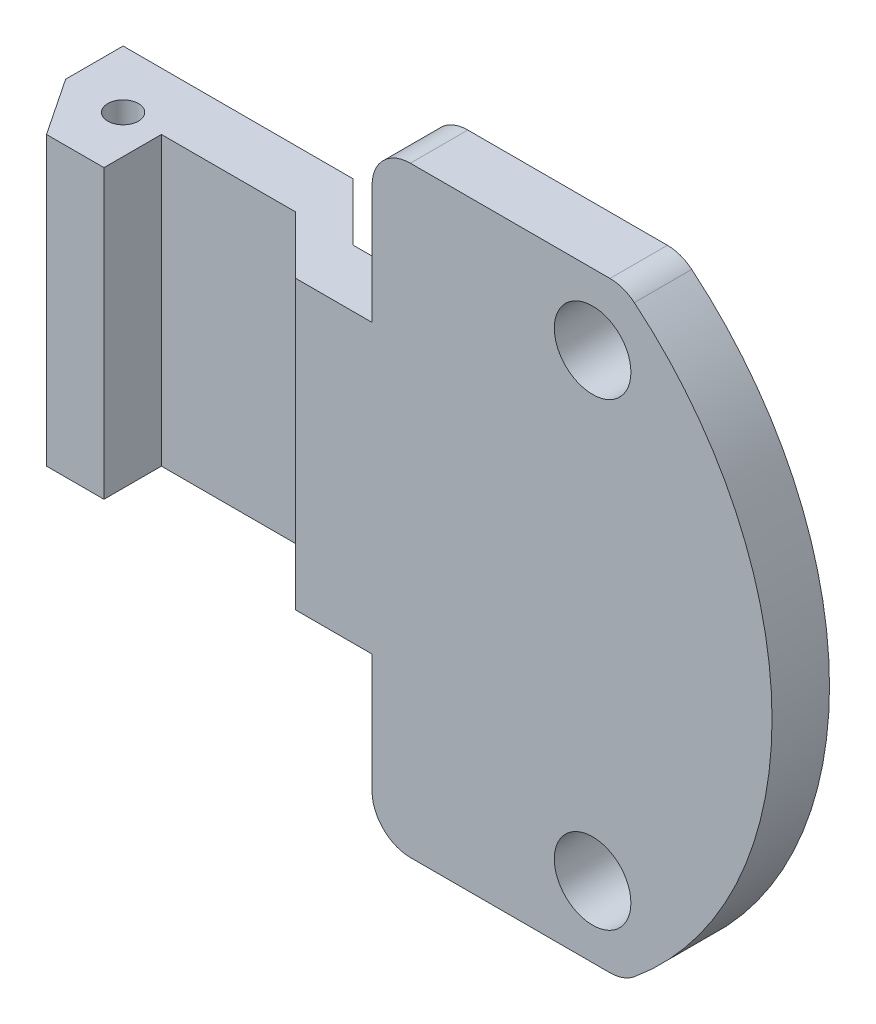
ISO-10303-21;
HEADER;
FILE_DESCRIPTION(('STEP AP214'),'2;1');
FILE_NAME('part.step','',(''),(''),'','','');
FILE_SCHEMA(('AUTOMOTIVE_DESIGN { 1 0 10303 214 1 1 1 1 }'));
ENDSEC;
DATA;
#1=APPLICATION_CONTEXT('core data for automotive mechanical design processes');
#2=APPLICATION_PROTOCOL_DEFINITION('international standard','automotive_design',2000,#1);
#3=PRODUCT_CONTEXT('',#1,'mechanical');
#4=PRODUCT('Part','Part','',(#3));
#5=PRODUCT_RELATED_PRODUCT_CATEGORY('part','',(#4));
#6=PRODUCT_DEFINITION_FORMATION('','',#4);
#7=PRODUCT_DEFINITION_CONTEXT('part definition',#1,'design');
#8=PRODUCT_DEFINITION('design','',#6,#7);
#9=PRODUCT_DEFINITION_SHAPE('','',#8);
#10=(LENGTH_UNIT() NAMED_UNIT(*) SI_UNIT(.MILLI.,.METRE.));
#11=(NAMED_UNIT(*) PLANE_ANGLE_UNIT() SI_UNIT($,.RADIAN.));
#12=(NAMED_UNIT(*) SI_UNIT($,.STERADIAN.) SOLID_ANGLE_UNIT());
#13=UNCERTAINTY_MEASURE_WITH_UNIT(LENGTH_MEASURE(1.E-05),#10,'distance_accuracy_value','');
#14=(GEOMETRIC_REPRESENTATION_CONTEXT(3) GLOBAL_UNCERTAINTY_ASSIGNED_CONTEXT((#13)) GLOBAL_UNIT_ASSIGNED_CONTEXT((#10,
#11,#12)) REPRESENTATION_CONTEXT('',''));
#15=CARTESIAN_POINT('',(0.,0.,0.));
#16=DIRECTION('',(0.,0.,1.));
#17=DIRECTION('',(1.,0.,0.));
#18=AXIS2_PLACEMENT_3D('',#15,#16,#17);
#19=CARTESIAN_POINT('',(0.,19.05,0.));
#20=DIRECTION('',(0.,1.,0.));
#21=DIRECTION('',(0.,0.,1.));
#22=AXIS2_PLACEMENT_3D('',#19,#20,#21);
#23=PLANE('',#22);
#24=CARTESIAN_POINT('',(-34.29,19.05,-3.81));
#25=DIRECTION('',(0.,1.,0.));
#26=DIRECTION('',(0.,0.,1.));
#27=AXIS2_PLACEMENT_3D('',#24,#25,#26);
#28=CIRCLE('',#27,1.016);
#29=CARTESIAN_POINT('',(-34.29,19.05,-4.826));
#30=VERTEX_POINT('',#29);
#31=EDGE_CURVE('E218',#30,#30,#28,.T.);
#32=ORIENTED_EDGE('',*,*,#31,.F.);
#33=EDGE_LOOP('',(#32));
#34=FACE_BOUND('',#33,.T.);
#35=DIRECTION('',(1.,0.,0.));
#36=VECTOR('',#35,1.);
#37=CARTESIAN_POINT('',(0.,19.05,0.));
#38=LINE('',#37,#36);
#39=CARTESIAN_POINT('',(-19.05,19.05,0.));
#40=VERTEX_POINT('',#39);
#41=CARTESIAN_POINT('',(-13.97,19.05,0.));
#42=VERTEX_POINT('',#41);
#43=EDGE_CURVE('E195',#40,#42,#38,.T.);
#44=ORIENTED_EDGE('',*,*,#43,.T.);
#45=DIRECTION('',(0.,0.,1.));
#46=VECTOR('',#45,1.);
#47=CARTESIAN_POINT('',(-13.97,19.05,-51.7043219116373));
#48=LINE('',#47,#46);
#49=CARTESIAN_POINT('',(-13.97,19.05,-3.80999999999998));
#50=VERTEX_POINT('',#49);
#51=EDGE_CURVE('E177',#50,#42,#48,.T.);
#52=ORIENTED_EDGE('',*,*,#51,.F.);
#53=DIRECTION('',(-1.,0.,0.));
#54=VECTOR('',#53,1.);
#55=CARTESIAN_POINT('',(-19.0500000000001,19.05,-3.80999999999998));
#56=LINE('',#55,#54);
#57=CARTESIAN_POINT('',(-19.0500000000001,19.05,-3.80999999999998));
#58=VERTEX_POINT('',#57);
#59=EDGE_CURVE('E204',#50,#58,#56,.T.);
#60=ORIENTED_EDGE('',*,*,#59,.T.);
#61=DIRECTION('',(-0.707106781186544,0.,-0.707106781186551));
#62=VECTOR('',#61,1.);
#63=CARTESIAN_POINT('',(-19.0500000000001,19.05,-3.80999999999998));
#64=LINE('',#63,#62);
#65=CARTESIAN_POINT('',(-22.86,19.05,-7.61999999999997));
#66=VERTEX_POINT('',#65);
#67=EDGE_CURVE('E206',#58,#66,#64,.T.);
#68=ORIENTED_EDGE('',*,*,#67,.T.);
#69=DIRECTION('',(-1.,0.,0.));
#70=VECTOR('',#69,1.);
#71=CARTESIAN_POINT('',(-31.75,19.05,-7.61999999999996));
#72=LINE('',#71,#70);
#73=CARTESIAN_POINT('',(-38.1,19.05,-7.61999999999996));
#74=VERTEX_POINT('',#73);
#75=EDGE_CURVE('E237',#66,#74,#72,.T.);
#76=ORIENTED_EDGE('',*,*,#75,.T.);
#77=DIRECTION('',(0.,0.,1.));
#78=VECTOR('',#77,1.);
#79=CARTESIAN_POINT('',(-38.1,19.05,-7.61999999999996));
#80=LINE('',#79,#78);
#81=CARTESIAN_POINT('',(-38.1,19.05,-3.81));
#82=VERTEX_POINT('',#81);
#83=EDGE_CURVE('E325',#74,#82,#80,.T.);
#84=ORIENTED_EDGE('',*,*,#83,.T.);
#85=DIRECTION('',(0.554700196225223,0.,0.832050294337848));
#86=VECTOR('',#85,1.);
#87=CARTESIAN_POINT('',(-38.1,19.05,-3.81));
#88=LINE('',#87,#86);
#89=CARTESIAN_POINT('',(-35.56,19.05,0.));
#90=VERTEX_POINT('',#89);
#91=EDGE_CURVE('E327',#82,#90,#88,.T.);
#92=ORIENTED_EDGE('',*,*,#91,.T.);
#93=DIRECTION('',(1.,0.,0.));
#94=VECTOR('',#93,1.);
#95=CARTESIAN_POINT('',(-35.56,19.05,0.));
#96=LINE('',#95,#94);
#97=CARTESIAN_POINT('',(-31.75,19.05,0.));
#98=VERTEX_POINT('',#97);
#99=EDGE_CURVE('E329',#90,#98,#96,.T.);
#100=ORIENTED_EDGE('',*,*,#99,.T.);
#101=DIRECTION('',(0.,0.,-1.));
#102=VECTOR('',#101,1.);
#103=CARTESIAN_POINT('',(-31.75,19.05,-3.81));
#104=LINE('',#103,#102);
#105=CARTESIAN_POINT('',(-31.75,19.05,-3.81));
#106=VERTEX_POINT('',#105);
#107=EDGE_CURVE('E331',#98,#106,#104,.T.);
#108=ORIENTED_EDGE('',*,*,#107,.T.);
#109=DIRECTION('',(1.,0.,0.));
#110=VECTOR('',#109,1.);
#111=CARTESIAN_POINT('',(-31.75,19.05,-3.81));
#112=LINE('',#111,#110);
#113=CARTESIAN_POINT('',(-22.86,19.05,-3.81));
#114=VERTEX_POINT('',#113);
#115=EDGE_CURVE('E208',#106,#114,#112,.T.);
#116=ORIENTED_EDGE('',*,*,#115,.T.);
#117=DIRECTION('',(0.707106781186548,0.,0.707106781186547));
#118=VECTOR('',#117,1.);
#119=CARTESIAN_POINT('',(-22.86,19.05,-3.81));
#120=LINE('',#119,#118);
#121=EDGE_CURVE('E202',#114,#40,#120,.T.);
#122=ORIENTED_EDGE('',*,*,#121,.T.);
#123=EDGE_LOOP('',(#44,#52,#60,#68,#76,#84,#92,#100,#108,#116,#122));
#124=FACE_BOUND('',#123,.T.);
#125=ADVANCED_FACE('F45',(#34,#124),#23,.T.);
#126=CARTESIAN_POINT('',(0.,0.,0.));
#127=DIRECTION('',(0.,1.,0.));
#128=DIRECTION('',(0.,0.,1.));
#129=AXIS2_PLACEMENT_3D('',#126,#127,#128);
#130=PLANE('',#129);
#131=DIRECTION('',(-1.,0.,0.));
#132=VECTOR('',#131,1.);
#133=CARTESIAN_POINT('',(-19.0500000000001,0.,-3.80999999999998));
#134=LINE('',#133,#132);
#135=CARTESIAN_POINT('',(-13.97,0.,-3.80999999999998));
#136=VERTEX_POINT('',#135);
#137=CARTESIAN_POINT('',(-19.0500000000001,0.,-3.80999999999998));
#138=VERTEX_POINT('',#137);
#139=EDGE_CURVE('E231',#136,#138,#134,.T.);
#140=ORIENTED_EDGE('',*,*,#139,.F.);
#141=DIRECTION('',(0.,0.,1.));
#142=VECTOR('',#141,1.);
#143=CARTESIAN_POINT('',(-13.97,0.,-51.7043219116373));
#144=LINE('',#143,#142);
#145=CARTESIAN_POINT('',(-13.97,0.,0.));
#146=VERTEX_POINT('',#145);
#147=EDGE_CURVE('E186',#136,#146,#144,.T.);
#148=ORIENTED_EDGE('',*,*,#147,.T.);
#149=DIRECTION('',(1.,0.,0.));
#150=VECTOR('',#149,1.);
#151=CARTESIAN_POINT('',(0.,0.,0.));
#152=LINE('',#151,#150);
#153=CARTESIAN_POINT('',(-19.05,0.,0.));
#154=VERTEX_POINT('',#153);
#155=EDGE_CURVE('E228',#154,#146,#152,.T.);
#156=ORIENTED_EDGE('',*,*,#155,.F.);
#157=DIRECTION('',(0.707106781186548,0.,0.707106781186547));
#158=VECTOR('',#157,1.);
#159=CARTESIAN_POINT('',(-22.86,0.,-3.81));
#160=LINE('',#159,#158);
#161=CARTESIAN_POINT('',(-22.86,0.,-3.81));
#162=VERTEX_POINT('',#161);
#163=EDGE_CURVE('E226',#162,#154,#160,.T.);
#164=ORIENTED_EDGE('',*,*,#163,.F.);
#165=DIRECTION('',(1.,0.,0.));
#166=VECTOR('',#165,1.);
#167=CARTESIAN_POINT('',(-31.75,0.,-3.81));
#168=LINE('',#167,#166);
#169=CARTESIAN_POINT('',(-31.75,0.,-3.81));
#170=VERTEX_POINT('',#169);
#171=EDGE_CURVE('E224',#170,#162,#168,.T.);
#172=ORIENTED_EDGE('',*,*,#171,.F.);
#173=DIRECTION('',(0.,0.,-1.));
#174=VECTOR('',#173,1.);
#175=CARTESIAN_POINT('',(-31.75,0.,-3.81));
#176=LINE('',#175,#174);
#177=CARTESIAN_POINT('',(-31.75,0.,0.));
#178=VERTEX_POINT('',#177);
#179=EDGE_CURVE('E222',#178,#170,#176,.T.);
#180=ORIENTED_EDGE('',*,*,#179,.F.);
#181=DIRECTION('',(1.,0.,0.));
#182=VECTOR('',#181,1.);
#183=CARTESIAN_POINT('',(-35.56,0.,0.));
#184=LINE('',#183,#182);
#185=CARTESIAN_POINT('',(-35.56,0.,0.));
#186=VERTEX_POINT('',#185);
#187=EDGE_CURVE('E220',#186,#178,#184,.T.);
#188=ORIENTED_EDGE('',*,*,#187,.F.);
#189=DIRECTION('',(0.554700196225223,0.,0.832050294337848));
#190=VECTOR('',#189,1.);
#191=CARTESIAN_POINT('',(-38.1,0.,-3.81));
#192=LINE('',#191,#190);
#193=CARTESIAN_POINT('',(-38.1,0.,-3.81));
#194=VERTEX_POINT('',#193);
#195=EDGE_CURVE('E217',#194,#186,#192,.T.);
#196=ORIENTED_EDGE('',*,*,#195,.F.);
#197=DIRECTION('',(0.,0.,1.));
#198=VECTOR('',#197,1.);
#199=CARTESIAN_POINT('',(-38.1,0.,-7.61999999999996));
#200=LINE('',#199,#198);
#201=CARTESIAN_POINT('',(-38.1,0.,-7.61999999999996));
#202=VERTEX_POINT('',#201);
#203=EDGE_CURVE('E215',#202,#194,#200,.T.);
#204=ORIENTED_EDGE('',*,*,#203,.F.);
#205=DIRECTION('',(-1.,0.,0.));
#206=VECTOR('',#205,1.);
#207=CARTESIAN_POINT('',(-22.86,0.,-7.61999999999997));
#208=LINE('',#207,#206);
#209=CARTESIAN_POINT('',(-22.86,0.,-7.61999999999997));
#210=VERTEX_POINT('',#209);
#211=EDGE_CURVE('E235',#210,#202,#208,.T.);
#212=ORIENTED_EDGE('',*,*,#211,.F.);
#213=DIRECTION('',(-0.707106781186544,0.,-0.707106781186551));
#214=VECTOR('',#213,1.);
#215=CARTESIAN_POINT('',(-19.0500000000001,0.,-3.80999999999998));
#216=LINE('',#215,#214);
#217=EDGE_CURVE('E233',#138,#210,#216,.T.);
#218=ORIENTED_EDGE('',*,*,#217,.F.);
#219=EDGE_LOOP('',(#140,#148,#156,#164,#172,#180,#188,#196,#204,#212,#218));
#220=FACE_BOUND('',#219,.T.);
#221=CARTESIAN_POINT('',(-34.29,0.,-3.81));
#222=DIRECTION('',(0.,1.,0.));
#223=DIRECTION('',(0.,0.,1.));
#224=AXIS2_PLACEMENT_3D('',#221,#222,#223);
#225=CIRCLE('',#224,1.016);
#226=CARTESIAN_POINT('',(-34.29,0.,-4.826));
#227=VERTEX_POINT('',#226);
#228=EDGE_CURVE('E320',#227,#227,#225,.T.);
#229=ORIENTED_EDGE('',*,*,#228,.T.);
#230=EDGE_LOOP('',(#229));
#231=FACE_BOUND('',#230,.T.);
#232=ADVANCED_FACE('F344',(#220,#231),#130,.F.);
#233=CARTESIAN_POINT('',(-38.1,19.05,-7.61999999999996));
#234=DIRECTION('',(1.,0.,0.));
#235=DIRECTION('',(0.,0.,-1.));
#236=AXIS2_PLACEMENT_3D('',#233,#234,#235);
#237=PLANE('',#236);
#238=ORIENTED_EDGE('',*,*,#203,.T.);
#239=DIRECTION('',(0.,-1.,0.));
#240=VECTOR('',#239,1.);
#241=CARTESIAN_POINT('',(-38.1,19.05,-3.81));
#242=LINE('',#241,#240);
#243=EDGE_CURVE('E257',#82,#194,#242,.T.);
#244=ORIENTED_EDGE('',*,*,#243,.F.);
#245=ORIENTED_EDGE('',*,*,#83,.F.);
#246=DIRECTION('',(0.,-1.,0.));
#247=VECTOR('',#246,1.);
#248=CARTESIAN_POINT('',(-38.1,19.05,-7.61999999999996));
#249=LINE('',#248,#247);
#250=EDGE_CURVE('E260',#74,#202,#249,.T.);
#251=ORIENTED_EDGE('',*,*,#250,.T.);
#252=EDGE_LOOP('',(#238,#244,#245,#251));
#253=FACE_BOUND('',#252,.T.);
#254=ADVANCED_FACE('F410',(#253),#237,.F.);
#255=CARTESIAN_POINT('',(-38.1,19.05,-3.81));
#256=DIRECTION('',(0.832050294337848,0.,-0.554700196225223));
#257=DIRECTION('',(-0.554700196225223,0.,-0.832050294337848));
#258=AXIS2_PLACEMENT_3D('',#255,#256,#257);
#259=PLANE('',#258);
#260=ORIENTED_EDGE('',*,*,#195,.T.);
#261=DIRECTION('',(0.,-1.,0.));
#262=VECTOR('',#261,1.);
#263=CARTESIAN_POINT('',(-35.56,19.05,0.));
#264=LINE('',#263,#262);
#265=EDGE_CURVE('E254',#90,#186,#264,.T.);
#266=ORIENTED_EDGE('',*,*,#265,.F.);
#267=ORIENTED_EDGE('',*,*,#91,.F.);
#268=ORIENTED_EDGE('',*,*,#243,.T.);
#269=EDGE_LOOP('',(#260,#266,#267,#268));
#270=FACE_BOUND('',#269,.T.);
#271=ADVANCED_FACE('F438',(#270),#259,.F.);
#272=CARTESIAN_POINT('',(-35.56,19.05,0.));
#273=DIRECTION('',(0.,0.,-1.));
#274=DIRECTION('',(-1.,0.,0.));
#275=AXIS2_PLACEMENT_3D('',#272,#273,#274);
#276=PLANE('',#275);
#277=ORIENTED_EDGE('',*,*,#187,.T.);
#278=DIRECTION('',(0.,-1.,0.));
#279=VECTOR('',#278,1.);
#280=CARTESIAN_POINT('',(-31.75,19.05,0.));
#281=LINE('',#280,#279);
#282=EDGE_CURVE('E251',#98,#178,#281,.T.);
#283=ORIENTED_EDGE('',*,*,#282,.F.);
#284=ORIENTED_EDGE('',*,*,#99,.F.);
#285=ORIENTED_EDGE('',*,*,#265,.T.);
#286=EDGE_LOOP('',(#277,#283,#284,#285));
#287=FACE_BOUND('',#286,.T.);
#288=ADVANCED_FACE('F434',(#287),#276,.F.);
#289=CARTESIAN_POINT('',(-31.75,19.05,-3.81));
#290=DIRECTION('',(-1.,0.,0.));
#291=DIRECTION('',(0.,0.,1.));
#292=AXIS2_PLACEMENT_3D('',#289,#290,#291);
#293=PLANE('',#292);
#294=ORIENTED_EDGE('',*,*,#179,.T.);
#295=DIRECTION('',(0.,-1.,0.));
#296=VECTOR('',#295,1.);
#297=CARTESIAN_POINT('',(-31.75,19.05,-3.81));
#298=LINE('',#297,#296);
#299=EDGE_CURVE('E248',#106,#170,#298,.T.);
#300=ORIENTED_EDGE('',*,*,#299,.F.);
#301=ORIENTED_EDGE('',*,*,#107,.F.);
#302=ORIENTED_EDGE('',*,*,#282,.T.);
#303=EDGE_LOOP('',(#294,#300,#301,#302));
#304=FACE_BOUND('',#303,.T.);
#305=ADVANCED_FACE('F431',(#304),#293,.F.);
#306=CARTESIAN_POINT('',(-31.75,19.05,-3.81));
#307=DIRECTION('',(0.,0.,-1.));
#308=DIRECTION('',(-1.,0.,0.));
#309=AXIS2_PLACEMENT_3D('',#306,#307,#308);
#310=PLANE('',#309);
#311=ORIENTED_EDGE('',*,*,#171,.T.);
#312=DIRECTION('',(0.,-1.,0.));
#313=VECTOR('',#312,1.);
#314=CARTESIAN_POINT('',(-22.86,19.05,-3.81));
#315=LINE('',#314,#313);
#316=EDGE_CURVE('E245',#114,#162,#315,.T.);
#317=ORIENTED_EDGE('',*,*,#316,.F.);
#318=ORIENTED_EDGE('',*,*,#115,.F.);
#319=ORIENTED_EDGE('',*,*,#299,.T.);
#320=EDGE_LOOP('',(#311,#317,#318,#319));
#321=FACE_BOUND('',#320,.T.);
#322=ADVANCED_FACE('F337',(#321),#310,.F.);
#323=CARTESIAN_POINT('',(-22.86,19.05,-3.81));
#324=DIRECTION('',(0.707106781186547,0.,-0.707106781186548));
#325=DIRECTION('',(-0.707106781186548,0.,-0.707106781186547));
#326=AXIS2_PLACEMENT_3D('',#323,#324,#325);
#327=PLANE('',#326);
#328=ORIENTED_EDGE('',*,*,#163,.T.);
#329=DIRECTION('',(0.,-1.,0.));
#330=VECTOR('',#329,1.);
#331=CARTESIAN_POINT('',(-19.05,19.05,0.));
#332=LINE('',#331,#330);
#333=EDGE_CURVE('E243',#40,#154,#332,.T.);
#334=ORIENTED_EDGE('',*,*,#333,.F.);
#335=ORIENTED_EDGE('',*,*,#121,.F.);
#336=ORIENTED_EDGE('',*,*,#316,.T.);
#337=EDGE_LOOP('',(#328,#334,#335,#336));
#338=FACE_BOUND('',#337,.T.);
#339=ADVANCED_FACE('F341',(#338),#327,.F.);
#340=CARTESIAN_POINT('',(0.,19.05,0.));
#341=DIRECTION('',(0.,0.,-1.));
#342=DIRECTION('',(-1.,0.,0.));
#343=AXIS2_PLACEMENT_3D('',#340,#341,#342);
#344=PLANE('',#343);
#345=DIRECTION('',(1.,0.,0.));
#346=VECTOR('',#345,1.);
#347=CARTESIAN_POINT('',(0.,-10.4139999999989,0.));
#348=LINE('',#347,#346);
#349=CARTESIAN_POINT('',(-11.43,-10.4139999999989,0.));
#350=VERTEX_POINT('',#349);
#351=CARTESIAN_POINT('',(1.80656142671847,-10.4139999999989,0.));
#352=VERTEX_POINT('',#351);
#353=EDGE_CURVE('E301',#350,#352,#348,.T.);
#354=ORIENTED_EDGE('',*,*,#353,.T.);
#355=CARTESIAN_POINT('',(1.80656142671847,-7.87399999999887,0.));
#356=DIRECTION('',(0.,0.,-1.));
#357=DIRECTION('',(-1.,0.,0.));
#358=AXIS2_PLACEMENT_3D('',#355,#356,#357);
#359=CIRCLE('',#358,2.54);
#360=CARTESIAN_POINT('',(3.4216088879706,-9.83441365479294,0.));
#361=VERTEX_POINT('',#360);
#362=EDGE_CURVE('E273',#352,#361,#359,.F.);
#363=ORIENTED_EDGE('',*,*,#362,.T.);
#364=CARTESIAN_POINT('',(-12.5272556784662,9.52500000000047,0.));
#365=DIRECTION('',(0.,0.,1.));
#366=DIRECTION('',(1.,0.,0.));
#367=AXIS2_PLACEMENT_3D('',#364,#365,#366);
#368=CIRCLE('',#367,25.0829260258038);
#369=CARTESIAN_POINT('',(3.42160888797036,28.8844136547941,0.));
#370=VERTEX_POINT('',#369);
#371=EDGE_CURVE('E365',#370,#361,#368,.F.);
#372=ORIENTED_EDGE('',*,*,#371,.F.);
#373=CARTESIAN_POINT('',(1.80656142671824,26.924,0.));
#374=DIRECTION('',(0.,0.,-1.));
#375=DIRECTION('',(-1.,0.,0.));
#376=AXIS2_PLACEMENT_3D('',#373,#374,#375);
#377=CIRCLE('',#376,2.54);
#378=CARTESIAN_POINT('',(1.80656142671824,29.464,0.));
#379=VERTEX_POINT('',#378);
#380=EDGE_CURVE('E271',#370,#379,#377,.F.);
#381=ORIENTED_EDGE('',*,*,#380,.T.);
#382=DIRECTION('',(1.,0.,0.));
#383=VECTOR('',#382,1.);
#384=CARTESIAN_POINT('',(0.,29.464,0.));
#385=LINE('',#384,#383);
#386=CARTESIAN_POINT('',(-11.43,29.464,0.));
#387=VERTEX_POINT('',#386);
#388=EDGE_CURVE('E199',#387,#379,#385,.T.);
#389=ORIENTED_EDGE('',*,*,#388,.F.);
#390=CARTESIAN_POINT('',(-11.43,26.924,0.));
#391=DIRECTION('',(0.,0.,-1.));
#392=DIRECTION('',(-1.,0.,0.));
#393=AXIS2_PLACEMENT_3D('',#390,#391,#392);
#394=CIRCLE('',#393,2.54);
#395=CARTESIAN_POINT('',(-13.97,26.924,0.));
#396=VERTEX_POINT('',#395);
#397=EDGE_CURVE('E197',#387,#396,#394,.F.);
#398=ORIENTED_EDGE('',*,*,#397,.T.);
#399=DIRECTION('',(0.,1.,0.));
#400=VECTOR('',#399,1.);
#401=CARTESIAN_POINT('',(-13.97,0.,0.));
#402=LINE('',#401,#400);
#403=EDGE_CURVE('E180',#42,#396,#402,.T.);
#404=ORIENTED_EDGE('',*,*,#403,.F.);
#405=ORIENTED_EDGE('',*,*,#43,.F.);
#406=ORIENTED_EDGE('',*,*,#333,.T.);
#407=ORIENTED_EDGE('',*,*,#155,.T.);
#408=DIRECTION('',(0.,-1.,0.));
#409=VECTOR('',#408,1.);
#410=CARTESIAN_POINT('',(-13.97,0.,0.));
#411=LINE('',#410,#409);
#412=CARTESIAN_POINT('',(-13.97,-7.87399999999887,0.));
#413=VERTEX_POINT('',#412);
#414=EDGE_CURVE('E198',#146,#413,#411,.T.);
#415=ORIENTED_EDGE('',*,*,#414,.T.);
#416=CARTESIAN_POINT('',(-11.43,-7.87399999999887,0.));
#417=DIRECTION('',(0.,0.,-1.));
#418=DIRECTION('',(-1.,0.,0.));
#419=AXIS2_PLACEMENT_3D('',#416,#417,#418);
#420=CIRCLE('',#419,2.54);
#421=EDGE_CURVE('E269',#413,#350,#420,.F.);
#422=ORIENTED_EDGE('',*,*,#421,.T.);
#423=EDGE_LOOP('',(#354,#363,#372,#381,#389,#398,#404,#405,#406,#407,#415,#422));
#424=FACE_BOUND('',#423,.T.);
#425=CARTESIAN_POINT('',(0.654823418347718,-5.71499999999961,0.));
#426=DIRECTION('',(0.,0.,1.));
#427=DIRECTION('',(1.,0.,0.));
#428=AXIS2_PLACEMENT_3D('',#425,#426,#427);
#429=CIRCLE('',#428,2.54);
#430=CARTESIAN_POINT('',(3.19482341834772,-5.71499999999961,0.));
#431=VERTEX_POINT('',#430);
#432=EDGE_CURVE('E303',#431,#431,#429,.T.);
#433=ORIENTED_EDGE('',*,*,#432,.F.);
#434=EDGE_LOOP('',(#433));
#435=FACE_BOUND('',#434,.T.);
#436=CARTESIAN_POINT('',(0.654823418347725,24.7650000000004,0.));
#437=DIRECTION('',(0.,0.,1.));
#438=DIRECTION('',(1.,0.,0.));
#439=AXIS2_PLACEMENT_3D('',#436,#437,#438);
#440=CIRCLE('',#439,2.54000000000005);
#441=CARTESIAN_POINT('',(3.19482341834778,24.7650000000004,0.));
#442=VERTEX_POINT('',#441);
#443=EDGE_CURVE('E187',#442,#442,#440,.T.);
#444=ORIENTED_EDGE('',*,*,#443,.F.);
#445=EDGE_LOOP('',(#444));
#446=FACE_BOUND('',#445,.T.);
#447=ADVANCED_FACE('F192',(#424,#435,#446),#344,.F.);
#448=CARTESIAN_POINT('',(-19.0500000000001,19.05,-3.80999999999998));
#449=DIRECTION('',(0.,0.,1.));
#450=DIRECTION('',(1.,0.,0.));
#451=AXIS2_PLACEMENT_3D('',#448,#449,#450);
#452=PLANE('',#451);
#453=CARTESIAN_POINT('',(-12.5272556784662,9.52500000000047,-3.80999999999998));
#454=DIRECTION('',(0.,0.,1.));
#455=DIRECTION('',(1.,0.,0.));
#456=AXIS2_PLACEMENT_3D('',#453,#454,#455);
#457=CIRCLE('',#456,25.0829260258038);
#458=CARTESIAN_POINT('',(3.4216088879706,-9.83441365479294,-3.80999999999998));
#459=VERTEX_POINT('',#458);
#460=CARTESIAN_POINT('',(3.42160888797036,28.8844136547941,-3.80999999999998));
#461=VERTEX_POINT('',#460);
#462=EDGE_CURVE('E317',#459,#461,#457,.T.);
#463=ORIENTED_EDGE('',*,*,#462,.F.);
#464=CARTESIAN_POINT('',(1.80656142671847,-7.87399999999887,-3.80999999999998));
#465=DIRECTION('',(0.,0.,1.));
#466=DIRECTION('',(1.,0.,0.));
#467=AXIS2_PLACEMENT_3D('',#464,#465,#466);
#468=CIRCLE('',#467,2.54);
#469=CARTESIAN_POINT('',(1.80656142671847,-10.4139999999989,-3.80999999999998));
#470=VERTEX_POINT('',#469);
#471=EDGE_CURVE('E284',#459,#470,#468,.F.);
#472=ORIENTED_EDGE('',*,*,#471,.T.);
#473=DIRECTION('',(-1.,0.,0.));
#474=VECTOR('',#473,1.);
#475=CARTESIAN_POINT('',(0.,-10.4139999999989,-3.80999999999998));
#476=LINE('',#475,#474);
#477=CARTESIAN_POINT('',(-11.43,-10.4139999999989,-3.80999999999998));
#478=VERTEX_POINT('',#477);
#479=EDGE_CURVE('E373',#470,#478,#476,.T.);
#480=ORIENTED_EDGE('',*,*,#479,.T.);
#481=CARTESIAN_POINT('',(-11.43,-7.87399999999887,-3.80999999999998));
#482=DIRECTION('',(0.,0.,1.));
#483=DIRECTION('',(1.,0.,0.));
#484=AXIS2_PLACEMENT_3D('',#481,#482,#483);
#485=CIRCLE('',#484,2.54);
#486=CARTESIAN_POINT('',(-13.97,-7.87399999999887,-3.80999999999998));
#487=VERTEX_POINT('',#486);
#488=EDGE_CURVE('E60',#478,#487,#485,.F.);
#489=ORIENTED_EDGE('',*,*,#488,.T.);
#490=DIRECTION('',(0.,1.,0.));
#491=VECTOR('',#490,1.);
#492=CARTESIAN_POINT('',(-13.97,0.,-3.80999999999998));
#493=LINE('',#492,#491);
#494=EDGE_CURVE('E297',#487,#136,#493,.T.);
#495=ORIENTED_EDGE('',*,*,#494,.T.);
#496=ORIENTED_EDGE('',*,*,#139,.T.);
#497=DIRECTION('',(0.,-1.,0.));
#498=VECTOR('',#497,1.);
#499=CARTESIAN_POINT('',(-19.0500000000001,19.05,-3.80999999999998));
#500=LINE('',#499,#498);
#501=EDGE_CURVE('E240',#58,#138,#500,.T.);
#502=ORIENTED_EDGE('',*,*,#501,.F.);
#503=ORIENTED_EDGE('',*,*,#59,.F.);
#504=DIRECTION('',(0.,-1.,0.));
#505=VECTOR('',#504,1.);
#506=CARTESIAN_POINT('',(-13.97,0.,-3.80999999999998));
#507=LINE('',#506,#505);
#508=CARTESIAN_POINT('',(-13.97,26.924,-3.80999999999998));
#509=VERTEX_POINT('',#508);
#510=EDGE_CURVE('E182',#509,#50,#507,.T.);
#511=ORIENTED_EDGE('',*,*,#510,.F.);
#512=CARTESIAN_POINT('',(-11.43,26.924,-3.80999999999998));
#513=DIRECTION('',(0.,0.,1.));
#514=DIRECTION('',(1.,0.,0.));
#515=AXIS2_PLACEMENT_3D('',#512,#513,#514);
#516=CIRCLE('',#515,2.54);
#517=CARTESIAN_POINT('',(-11.43,29.464,-3.80999999999998));
#518=VERTEX_POINT('',#517);
#519=EDGE_CURVE('E67',#509,#518,#516,.F.);
#520=ORIENTED_EDGE('',*,*,#519,.T.);
#521=DIRECTION('',(-1.,0.,0.));
#522=VECTOR('',#521,1.);
#523=CARTESIAN_POINT('',(0.,29.464,-3.80999999999998));
#524=LINE('',#523,#522);
#525=CARTESIAN_POINT('',(1.80656142671824,29.464,-3.80999999999998));
#526=VERTEX_POINT('',#525);
#527=EDGE_CURVE('E311',#526,#518,#524,.T.);
#528=ORIENTED_EDGE('',*,*,#527,.F.);
#529=CARTESIAN_POINT('',(1.80656142671824,26.924,-3.80999999999998));
#530=DIRECTION('',(0.,0.,1.));
#531=DIRECTION('',(1.,0.,0.));
#532=AXIS2_PLACEMENT_3D('',#529,#530,#531);
#533=CIRCLE('',#532,2.54);
#534=EDGE_CURVE('E282',#526,#461,#533,.F.);
#535=ORIENTED_EDGE('',*,*,#534,.T.);
#536=EDGE_LOOP('',(#463,#472,#480,#489,#495,#496,#502,#503,#511,#520,#528,#535));
#537=FACE_BOUND('',#536,.T.);
#538=CARTESIAN_POINT('',(0.654823418347725,24.7650000000004,-3.80999999999998));
#539=DIRECTION('',(0.,0.,1.));
#540=DIRECTION('',(1.,0.,0.));
#541=AXIS2_PLACEMENT_3D('',#538,#539,#540);
#542=CIRCLE('',#541,2.54000000000005);
#543=CARTESIAN_POINT('',(3.19482341834778,24.7650000000004,-3.80999999999998));
#544=VERTEX_POINT('',#543);
#545=EDGE_CURVE('E313',#544,#544,#542,.F.);
#546=ORIENTED_EDGE('',*,*,#545,.F.);
#547=EDGE_LOOP('',(#546));
#548=FACE_BOUND('',#547,.T.);
#549=CARTESIAN_POINT('',(0.654823418347718,-5.71499999999961,-3.80999999999998));
#550=DIRECTION('',(0.,0.,1.));
#551=DIRECTION('',(1.,0.,0.));
#552=AXIS2_PLACEMENT_3D('',#549,#550,#551);
#553=CIRCLE('',#552,2.54);
#554=CARTESIAN_POINT('',(3.19482341834772,-5.71499999999961,-3.80999999999998));
#555=VERTEX_POINT('',#554);
#556=EDGE_CURVE('E316',#555,#555,#553,.F.);
#557=ORIENTED_EDGE('',*,*,#556,.F.);
#558=EDGE_LOOP('',(#557));
#559=FACE_BOUND('',#558,.T.);
#560=ADVANCED_FACE('F350',(#537,#548,#559),#452,.F.);
#561=CARTESIAN_POINT('',(-19.0500000000001,19.05,-3.80999999999998));
#562=DIRECTION('',(-0.707106781186551,0.,0.707106781186544));
#563=DIRECTION('',(0.707106781186544,0.,0.707106781186551));
#564=AXIS2_PLACEMENT_3D('',#561,#562,#563);
#565=PLANE('',#564);
#566=ORIENTED_EDGE('',*,*,#217,.T.);
#567=DIRECTION('',(0.,-1.,0.));
#568=VECTOR('',#567,1.);
#569=CARTESIAN_POINT('',(-22.86,19.05,-7.61999999999997));
#570=LINE('',#569,#568);
#571=EDGE_CURVE('E214',#66,#210,#570,.T.);
#572=ORIENTED_EDGE('',*,*,#571,.F.);
#573=ORIENTED_EDGE('',*,*,#67,.F.);
#574=ORIENTED_EDGE('',*,*,#501,.T.);
#575=EDGE_LOOP('',(#566,#572,#573,#574));
#576=FACE_BOUND('',#575,.T.);
#577=ADVANCED_FACE('F354',(#576),#565,.F.);
#578=CARTESIAN_POINT('',(-22.86,19.05,-7.61999999999997));
#579=DIRECTION('',(0.,0.,1.));
#580=DIRECTION('',(1.,0.,0.));
#581=AXIS2_PLACEMENT_3D('',#578,#579,#580);
#582=PLANE('',#581);
#583=ORIENTED_EDGE('',*,*,#211,.T.);
#584=ORIENTED_EDGE('',*,*,#250,.F.);
#585=ORIENTED_EDGE('',*,*,#75,.F.);
#586=ORIENTED_EDGE('',*,*,#571,.T.);
#587=EDGE_LOOP('',(#583,#584,#585,#586));
#588=FACE_BOUND('',#587,.T.);
#589=ADVANCED_FACE('F417',(#588),#582,.F.);
#590=CARTESIAN_POINT('',(-34.29,19.05,-3.81));
#591=DIRECTION('',(0.,-1.,0.));
#592=DIRECTION('',(0.,0.,-1.));
#593=AXIS2_PLACEMENT_3D('',#590,#591,#592);
#594=CYLINDRICAL_SURFACE('',#593,1.016);
#595=CARTESIAN_POINT('',(-34.29,19.05,-4.826));
#596=CARTESIAN_POINT('',(-34.29,18.8515625,-4.826));
#597=CARTESIAN_POINT('',(-34.29,18.653125,-4.826));
#598=CARTESIAN_POINT('',(-34.29,18.25625,-4.826));
#599=CARTESIAN_POINT('',(-34.29,18.0578125,-4.826));
#600=CARTESIAN_POINT('',(-34.29,17.6609375,-4.826));
#601=CARTESIAN_POINT('',(-34.29,17.4625,-4.826));
#602=CARTESIAN_POINT('',(-34.29,17.065625,-4.826));
#603=CARTESIAN_POINT('',(-34.29,16.8671875,-4.826));
#604=CARTESIAN_POINT('',(-34.29,16.4703125,-4.826));
#605=CARTESIAN_POINT('',(-34.29,16.271875,-4.826));
#606=CARTESIAN_POINT('',(-34.29,15.875,-4.826));
#607=CARTESIAN_POINT('',(-34.29,15.6765625,-4.826));
#608=CARTESIAN_POINT('',(-34.29,15.2796875,-4.826));
#609=CARTESIAN_POINT('',(-34.29,15.08125,-4.826));
#610=CARTESIAN_POINT('',(-34.29,14.684375,-4.826));
#611=CARTESIAN_POINT('',(-34.29,14.4859375,-4.826));
#612=CARTESIAN_POINT('',(-34.29,14.0890625,-4.826));
#613=CARTESIAN_POINT('',(-34.29,13.890625,-4.826));
#614=CARTESIAN_POINT('',(-34.29,13.49375,-4.826));
#615=CARTESIAN_POINT('',(-34.29,13.2953125,-4.826));
#616=CARTESIAN_POINT('',(-34.29,12.8984375,-4.826));
#617=CARTESIAN_POINT('',(-34.29,12.7,-4.826));
#618=CARTESIAN_POINT('',(-34.29,12.303125,-4.826));
#619=CARTESIAN_POINT('',(-34.29,12.1046875,-4.826));
#620=CARTESIAN_POINT('',(-34.29,11.7078125,-4.826));
#621=CARTESIAN_POINT('',(-34.29,11.509375,-4.826));
#622=CARTESIAN_POINT('',(-34.29,11.1125,-4.826));
#623=CARTESIAN_POINT('',(-34.29,10.9140625,-4.826));
#624=CARTESIAN_POINT('',(-34.29,10.5171875,-4.826));
#625=CARTESIAN_POINT('',(-34.29,10.31875,-4.826));
#626=CARTESIAN_POINT('',(-34.29,9.921875,-4.826));
#627=CARTESIAN_POINT('',(-34.29,9.7234375,-4.826));
#628=CARTESIAN_POINT('',(-34.29,9.3265625,-4.826));
#629=CARTESIAN_POINT('',(-34.29,9.128125,-4.826));
#630=CARTESIAN_POINT('',(-34.29,8.73125,-4.826));
#631=CARTESIAN_POINT('',(-34.29,8.5328125,-4.826));
#632=CARTESIAN_POINT('',(-34.29,8.1359375,-4.826));
#633=CARTESIAN_POINT('',(-34.29,7.9375,-4.826));
#634=CARTESIAN_POINT('',(-34.29,7.540625,-4.826));
#635=CARTESIAN_POINT('',(-34.29,7.3421875,-4.826));
#636=CARTESIAN_POINT('',(-34.29,6.9453125,-4.826));
#637=CARTESIAN_POINT('',(-34.29,6.746875,-4.826));
#638=CARTESIAN_POINT('',(-34.29,6.35,-4.826));
#639=CARTESIAN_POINT('',(-34.29,6.1515625,-4.826));
#640=CARTESIAN_POINT('',(-34.29,5.7546875,-4.826));
#641=CARTESIAN_POINT('',(-34.29,5.55625,-4.826));
#642=CARTESIAN_POINT('',(-34.29,5.159375,-4.826));
#643=CARTESIAN_POINT('',(-34.29,4.9609375,-4.826));
#644=CARTESIAN_POINT('',(-34.29,4.5640625,-4.826));
#645=CARTESIAN_POINT('',(-34.29,4.365625,-4.826));
#646=CARTESIAN_POINT('',(-34.29,3.96875,-4.826));
#647=CARTESIAN_POINT('',(-34.29,3.7703125,-4.826));
#648=CARTESIAN_POINT('',(-34.29,3.3734375,-4.826));
#649=CARTESIAN_POINT('',(-34.29,3.175,-4.826));
#650=CARTESIAN_POINT('',(-34.29,2.778125,-4.826));
#651=CARTESIAN_POINT('',(-34.29,2.5796875,-4.826));
#652=CARTESIAN_POINT('',(-34.29,2.1828125,-4.826));
#653=CARTESIAN_POINT('',(-34.29,1.984375,-4.826));
#654=CARTESIAN_POINT('',(-34.29,1.5875,-4.826));
#655=CARTESIAN_POINT('',(-34.29,1.3890625,-4.826));
#656=CARTESIAN_POINT('',(-34.29,0.992187500000001,-4.826));
#657=CARTESIAN_POINT('',(-34.29,0.793750000000001,-4.826));
#658=CARTESIAN_POINT('',(-34.29,0.396875,-4.826));
#659=CARTESIAN_POINT('',(-34.29,0.1984375,-4.826));
#660=CARTESIAN_POINT('',(-34.29,0.,-4.826));
#661=B_SPLINE_CURVE_WITH_KNOTS('',3,(#595,#596,#597,#598,#599,#600,#601,#602,#603,#604,#605,
#606,#607,#608,#609,#610,#611,#612,#613,#614,#615,#616,#617,#618,#619,#620,#621,#622,#623,#624,
#625,#626,#627,#628,#629,#630,#631,#632,#633,#634,#635,#636,#637,#638,#639,#640,#641,#642,#643,
#644,#645,#646,#647,#648,#649,#650,#651,#652,#653,#654,#655,#656,#657,#658,#659,#660),
.UNSPECIFIED.,.F.,.F.,(4,2,2,2,2,2,2,2,2,2,2,2,2,2,2,2,2,2,2,2,2,2,2,2,2,2,2,2,2,2,2,2,4),(0.,
0.5953125,1.190625,1.7859375,2.38125,2.9765625,3.571875,4.1671875,4.7625,5.3578125,5.953125,
6.5484375,7.14375,7.7390625,8.334375,8.9296875,9.525,10.1203125,10.715625,11.3109375,11.90625,
12.5015625,13.096875,13.6921875,14.2875,14.8828125,15.478125,16.0734375,16.66875,17.2640625,
17.859375,18.4546875,19.05),.UNSPECIFIED.);
#662=EDGE_CURVE('BSEAM414',#30,#227,#661,.T.);
#663=ORIENTED_EDGE('',*,*,#31,.T.);
#664=ORIENTED_EDGE('',*,*,#228,.F.);
#665=ORIENTED_EDGE('',*,*,#662,.T.);
#666=ORIENTED_EDGE('',*,*,#662,.F.);
#667=EDGE_LOOP('',(#663,#665,#664,#666));
#668=FACE_BOUND('',#667,.T.);
#669=ADVANCED_FACE('F414',(#668),#594,.F.);
#670=CARTESIAN_POINT('',(0.654823418347718,-5.71499999999961,-51.7043219116373));
#671=DIRECTION('',(0.,0.,1.));
#672=DIRECTION('',(1.,0.,0.));
#673=AXIS2_PLACEMENT_3D('',#670,#671,#672);
#674=CYLINDRICAL_SURFACE('',#673,2.54);
#675=ORIENTED_EDGE('',*,*,#556,.T.);
#676=EDGE_LOOP('',(#675));
#677=FACE_BOUND('',#676,.T.);
#678=ORIENTED_EDGE('',*,*,#432,.T.);
#679=EDGE_LOOP('',(#678));
#680=FACE_BOUND('',#679,.T.);
#681=ADVANCED_FACE('F498',(#677,#680),#674,.F.);
#682=CARTESIAN_POINT('',(0.,29.464,-51.7043219116373));
#683=DIRECTION('',(0.,-1.,0.));
#684=DIRECTION('',(1.,0.,0.));
#685=AXIS2_PLACEMENT_3D('',#682,#683,#684);
#686=PLANE('',#685);
#687=ORIENTED_EDGE('',*,*,#388,.T.);
#688=DIRECTION('',(0.,0.,1.));
#689=VECTOR('',#688,1.);
#690=CARTESIAN_POINT('',(1.80656142671824,29.464,-51.7043219116373));
#691=LINE('',#690,#689);
#692=EDGE_CURVE('E289',#379,#526,#691,.F.);
#693=ORIENTED_EDGE('',*,*,#692,.T.);
#694=ORIENTED_EDGE('',*,*,#527,.T.);
#695=DIRECTION('',(0.,0.,1.));
#696=VECTOR('',#695,1.);
#697=CARTESIAN_POINT('',(-11.43,29.464,-51.7043219116373));
#698=LINE('',#697,#696);
#699=EDGE_CURVE('E286',#518,#387,#698,.T.);
#700=ORIENTED_EDGE('',*,*,#699,.T.);
#701=EDGE_LOOP('',(#687,#693,#694,#700));
#702=FACE_BOUND('',#701,.T.);
#703=ADVANCED_FACE('F362',(#702),#686,.F.);
#704=CARTESIAN_POINT('',(-13.97,0.,-51.7043219116373));
#705=DIRECTION('',(1.,0.,0.));
#706=DIRECTION('',(0.,1.,0.));
#707=AXIS2_PLACEMENT_3D('',#704,#705,#706);
#708=PLANE('',#707);
#709=ORIENTED_EDGE('',*,*,#403,.T.);
#710=DIRECTION('',(0.,0.,1.));
#711=VECTOR('',#710,1.);
#712=CARTESIAN_POINT('',(-13.97,26.924,-51.7043219116373));
#713=LINE('',#712,#711);
#714=EDGE_CURVE('E11',#396,#509,#713,.F.);
#715=ORIENTED_EDGE('',*,*,#714,.T.);
#716=ORIENTED_EDGE('',*,*,#510,.T.);
#717=ORIENTED_EDGE('',*,*,#51,.T.);
#718=EDGE_LOOP('',(#709,#715,#716,#717));
#719=FACE_BOUND('',#718,.T.);
#720=ADVANCED_FACE('F179',(#719),#708,.F.);
#721=CARTESIAN_POINT('',(-13.97,0.,-51.7043219116373));
#722=DIRECTION('',(-1.,0.,0.));
#723=DIRECTION('',(0.,-1.,0.));
#724=AXIS2_PLACEMENT_3D('',#721,#722,#723);
#725=PLANE('',#724);
#726=ORIENTED_EDGE('',*,*,#494,.F.);
#727=DIRECTION('',(0.,0.,1.));
#728=VECTOR('',#727,1.);
#729=CARTESIAN_POINT('',(-13.97,-7.87399999999887,-51.7043219116373));
#730=LINE('',#729,#728);
#731=EDGE_CURVE('E53',#487,#413,#730,.T.);
#732=ORIENTED_EDGE('',*,*,#731,.T.);
#733=ORIENTED_EDGE('',*,*,#414,.F.);
#734=ORIENTED_EDGE('',*,*,#147,.F.);
#735=EDGE_LOOP('',(#726,#732,#733,#734));
#736=FACE_BOUND('',#735,.T.);
#737=ADVANCED_FACE('F294',(#736),#725,.T.);
#738=CARTESIAN_POINT('',(0.,-10.4139999999989,-51.7043219116373));
#739=DIRECTION('',(0.,-1.,0.));
#740=DIRECTION('',(1.,0.,0.));
#741=AXIS2_PLACEMENT_3D('',#738,#739,#740);
#742=PLANE('',#741);
#743=ORIENTED_EDGE('',*,*,#479,.F.);
#744=DIRECTION('',(0.,0.,-1.));
#745=VECTOR('',#744,1.);
#746=CARTESIAN_POINT('',(1.80656142671847,-10.4139999999989,0.));
#747=LINE('',#746,#745);
#748=EDGE_CURVE('E265',#470,#352,#747,.F.);
#749=ORIENTED_EDGE('',*,*,#748,.T.);
#750=ORIENTED_EDGE('',*,*,#353,.F.);
#751=DIRECTION('',(0.,0.,1.));
#752=VECTOR('',#751,1.);
#753=CARTESIAN_POINT('',(-11.43,-10.4139999999989,-51.7043219116373));
#754=LINE('',#753,#752);
#755=EDGE_CURVE('E263',#350,#478,#754,.F.);
#756=ORIENTED_EDGE('',*,*,#755,.T.);
#757=EDGE_LOOP('',(#743,#749,#750,#756));
#758=FACE_BOUND('',#757,.T.);
#759=ADVANCED_FACE('F382',(#758),#742,.T.);
#760=CARTESIAN_POINT('',(-12.5272556784662,9.52500000000047,-51.7043219116373));
#761=DIRECTION('',(0.,0.,1.));
#762=DIRECTION('',(1.,0.,0.));
#763=AXIS2_PLACEMENT_3D('',#760,#761,#762);
#764=CYLINDRICAL_SURFACE('',#763,25.0829260258038);
#765=ORIENTED_EDGE('',*,*,#371,.T.);
#766=DIRECTION('',(0.,0.,1.));
#767=VECTOR('',#766,1.);
#768=CARTESIAN_POINT('',(3.42160888797061,-9.83441365479294,-51.7043219116373));
#769=LINE('',#768,#767);
#770=EDGE_CURVE('E278',#361,#459,#769,.F.);
#771=ORIENTED_EDGE('',*,*,#770,.T.);
#772=ORIENTED_EDGE('',*,*,#462,.T.);
#773=DIRECTION('',(0.,0.,1.));
#774=VECTOR('',#773,1.);
#775=CARTESIAN_POINT('',(3.42160888797036,28.8844136547941,-51.7043219116373));
#776=LINE('',#775,#774);
#777=EDGE_CURVE('E275',#461,#370,#776,.T.);
#778=ORIENTED_EDGE('',*,*,#777,.T.);
#779=EDGE_LOOP('',(#765,#771,#772,#778));
#780=FACE_BOUND('',#779,.T.);
#781=ADVANCED_FACE('F386',(#780),#764,.T.);
#782=CARTESIAN_POINT('',(0.654823418347725,24.7650000000004,-51.7043219116373));
#783=DIRECTION('',(0.,0.,1.));
#784=DIRECTION('',(1.,0.,0.));
#785=AXIS2_PLACEMENT_3D('',#782,#783,#784);
#786=CYLINDRICAL_SURFACE('',#785,2.54000000000005);
#787=ORIENTED_EDGE('',*,*,#545,.T.);
#788=EDGE_LOOP('',(#787));
#789=FACE_BOUND('',#788,.T.);
#790=ORIENTED_EDGE('',*,*,#443,.T.);
#791=EDGE_LOOP('',(#790));
#792=FACE_BOUND('',#791,.T.);
#793=ADVANCED_FACE('F391',(#789,#792),#786,.F.);
#794=CARTESIAN_POINT('',(1.80656142671847,-7.87399999999887,-51.7043219116373));
#795=DIRECTION('',(0.,0.,1.));
#796=DIRECTION('',(1.,0.,0.));
#797=AXIS2_PLACEMENT_3D('',#794,#795,#796);
#798=CYLINDRICAL_SURFACE('',#797,2.54);
#799=ORIENTED_EDGE('',*,*,#471,.F.);
#800=ORIENTED_EDGE('',*,*,#770,.F.);
#801=ORIENTED_EDGE('',*,*,#362,.F.);
#802=ORIENTED_EDGE('',*,*,#748,.F.);
#803=EDGE_LOOP('',(#799,#800,#801,#802));
#804=FACE_BOUND('',#803,.T.);
#805=ADVANCED_FACE('F388',(#804),#798,.T.);
#806=CARTESIAN_POINT('',(1.80656142671824,26.924,-51.7043219116373));
#807=DIRECTION('',(0.,0.,1.));
#808=DIRECTION('',(1.,0.,0.));
#809=AXIS2_PLACEMENT_3D('',#806,#807,#808);
#810=CYLINDRICAL_SURFACE('',#809,2.54);
#811=ORIENTED_EDGE('',*,*,#534,.F.);
#812=ORIENTED_EDGE('',*,*,#692,.F.);
#813=ORIENTED_EDGE('',*,*,#380,.F.);
#814=ORIENTED_EDGE('',*,*,#777,.F.);
#815=EDGE_LOOP('',(#811,#812,#813,#814));
#816=FACE_BOUND('',#815,.T.);
#817=ADVANCED_FACE('F390',(#816),#810,.T.);
#818=CARTESIAN_POINT('',(-11.43,-7.87399999999887,-51.7043219116373));
#819=DIRECTION('',(0.,0.,1.));
#820=DIRECTION('',(1.,0.,0.));
#821=AXIS2_PLACEMENT_3D('',#818,#819,#820);
#822=CYLINDRICAL_SURFACE('',#821,2.54);
#823=ORIENTED_EDGE('',*,*,#488,.F.);
#824=ORIENTED_EDGE('',*,*,#755,.F.);
#825=ORIENTED_EDGE('',*,*,#421,.F.);
#826=ORIENTED_EDGE('',*,*,#731,.F.);
#827=EDGE_LOOP('',(#823,#824,#825,#826));
#828=FACE_BOUND('',#827,.T.);
#829=ADVANCED_FACE('F381',(#828),#822,.T.);
#830=CARTESIAN_POINT('',(-11.43,26.924,-51.7043219116373));
#831=DIRECTION('',(0.,0.,1.));
#832=DIRECTION('',(1.,0.,0.));
#833=AXIS2_PLACEMENT_3D('',#830,#831,#832);
#834=CYLINDRICAL_SURFACE('',#833,2.54);
#835=ORIENTED_EDGE('',*,*,#519,.F.);
#836=ORIENTED_EDGE('',*,*,#714,.F.);
#837=ORIENTED_EDGE('',*,*,#397,.F.);
#838=ORIENTED_EDGE('',*,*,#699,.F.);
#839=EDGE_LOOP('',(#835,#836,#837,#838));
#840=FACE_BOUND('',#839,.T.);
#841=ADVANCED_FACE('F47',(#840),#834,.T.);
#842=CLOSED_SHELL('',(#125,#232,#254,#271,#288,#305,#322,#339,#447,#560,#577,#589,#669,#681,
#703,#720,#737,#759,#781,#793,#805,#817,#829,#841));
#843=MANIFOLD_SOLID_BREP('B2',#842);
#844=ADVANCED_BREP_SHAPE_REPRESENTATION('',(#18,#843),#14);
#845=SHAPE_DEFINITION_REPRESENTATION(#9,#844);
ENDSEC;
END-ISO-10303-21;
